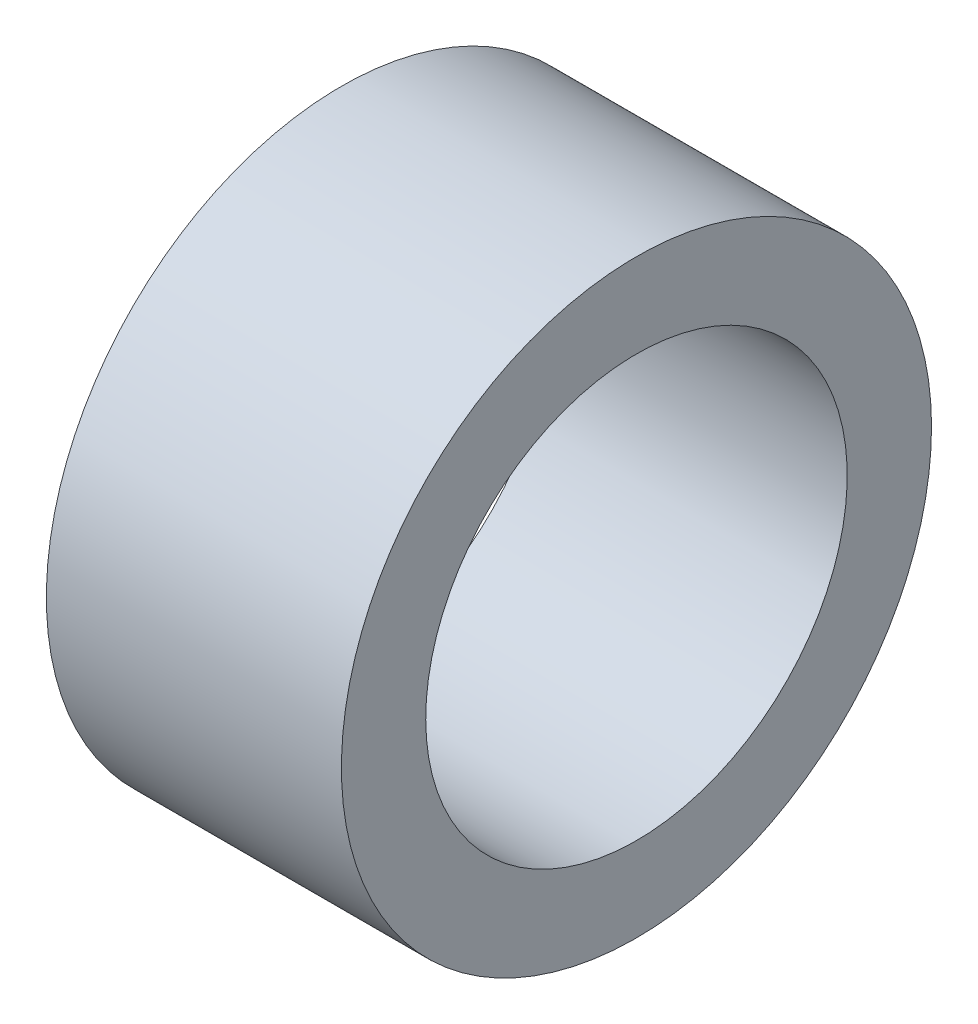
ISO-10303-21;
HEADER;
FILE_DESCRIPTION(('STEP AP214'),'2;1');
FILE_NAME('part.step','',(''),(''),'','','');
FILE_SCHEMA(('AUTOMOTIVE_DESIGN { 1 0 10303 214 1 1 1 1 }'));
ENDSEC;
DATA;
#1=APPLICATION_CONTEXT('core data for automotive mechanical design processes');
#2=APPLICATION_PROTOCOL_DEFINITION('international standard','automotive_design',2000,#1);
#3=PRODUCT_CONTEXT('',#1,'mechanical');
#4=PRODUCT('Part','Part','',(#3));
#5=PRODUCT_RELATED_PRODUCT_CATEGORY('part','',(#4));
#6=PRODUCT_DEFINITION_FORMATION('','',#4);
#7=PRODUCT_DEFINITION_CONTEXT('part definition',#1,'design');
#8=PRODUCT_DEFINITION('design','',#6,#7);
#9=PRODUCT_DEFINITION_SHAPE('','',#8);
#10=(LENGTH_UNIT() NAMED_UNIT(*) SI_UNIT(.MILLI.,.METRE.));
#11=(NAMED_UNIT(*) PLANE_ANGLE_UNIT() SI_UNIT($,.RADIAN.));
#12=(NAMED_UNIT(*) SI_UNIT($,.STERADIAN.) SOLID_ANGLE_UNIT());
#13=UNCERTAINTY_MEASURE_WITH_UNIT(LENGTH_MEASURE(1.E-05),#10,'distance_accuracy_value','');
#14=(GEOMETRIC_REPRESENTATION_CONTEXT(3) GLOBAL_UNCERTAINTY_ASSIGNED_CONTEXT((#13)) GLOBAL_UNIT_ASSIGNED_CONTEXT((#10,
#11,#12)) REPRESENTATION_CONTEXT('',''));
#15=CARTESIAN_POINT('',(0.,0.,0.));
#16=DIRECTION('',(0.,0.,1.));
#17=DIRECTION('',(1.,0.,0.));
#18=AXIS2_PLACEMENT_3D('',#15,#16,#17);
#19=CARTESIAN_POINT('',(-170.500000000003,37.9999999999994,8.91815473725468));
#20=DIRECTION('',(1.,0.,0.));
#21=DIRECTION('',(0.,0.245859277636287,-0.969305532636724));
#22=AXIS2_PLACEMENT_3D('',#19,#20,#21);
#23=CYLINDRICAL_SURFACE('',#22,3.);
#24=CARTESIAN_POINT('',(-170.500000000003,37.9999999999994,8.91815473725468));
#25=DIRECTION('',(-1.,0.,0.));
#26=DIRECTION('',(0.,-0.245859277636287,0.969305532636724));
#27=AXIS2_PLACEMENT_3D('',#24,#25,#26);
#28=CIRCLE('',#27,3.);
#29=CARTESIAN_POINT('',(-170.500000000003,37.2624221670905,11.8260713351649));
#30=VERTEX_POINT('',#29);
#31=EDGE_CURVE('E10',#30,#30,#28,.T.);
#32=ORIENTED_EDGE('',*,*,#31,.T.);
#33=EDGE_LOOP('',(#32));
#34=FACE_BOUND('',#33,.T.);
#35=CARTESIAN_POINT('',(-166.300000000003,37.9999999999994,8.91815473725468));
#36=DIRECTION('',(-1.,0.,0.));
#37=DIRECTION('',(0.,-0.245859277636287,0.969305532636724));
#38=AXIS2_PLACEMENT_3D('',#35,#36,#37);
#39=CIRCLE('',#38,3.);
#40=CARTESIAN_POINT('',(-166.300000000003,37.2624221670905,11.8260713351649));
#41=VERTEX_POINT('',#40);
#42=EDGE_CURVE('E29',#41,#41,#39,.T.);
#43=ORIENTED_EDGE('',*,*,#42,.F.);
#44=EDGE_LOOP('',(#43));
#45=FACE_BOUND('',#44,.T.);
#46=ADVANCED_FACE('F15',(#34,#45),#23,.F.);
#47=CARTESIAN_POINT('',(-170.500000000003,37.9999999999994,8.91815473725468));
#48=DIRECTION('',(1.,0.,0.));
#49=DIRECTION('',(0.,0.245859277636287,-0.969305532636724));
#50=AXIS2_PLACEMENT_3D('',#47,#48,#49);
#51=CYLINDRICAL_SURFACE('',#50,4.2);
#52=CARTESIAN_POINT('',(-170.500000000003,37.9999999999994,8.91815473725468));
#53=DIRECTION('',(-1.,0.,0.));
#54=DIRECTION('',(0.,-0.245859277636287,0.969305532636724));
#55=AXIS2_PLACEMENT_3D('',#52,#53,#54);
#56=CIRCLE('',#55,4.2);
#57=CARTESIAN_POINT('',(-170.500000000003,36.967391033927,12.9892379743289));
#58=VERTEX_POINT('',#57);
#59=EDGE_CURVE('E22',#58,#58,#56,.T.);
#60=ORIENTED_EDGE('',*,*,#59,.F.);
#61=EDGE_LOOP('',(#60));
#62=FACE_BOUND('',#61,.T.);
#63=CARTESIAN_POINT('',(-166.300000000003,37.9999999999994,8.91815473725468));
#64=DIRECTION('',(-1.,0.,0.));
#65=DIRECTION('',(0.,-0.245859277636287,0.969305532636724));
#66=AXIS2_PLACEMENT_3D('',#63,#64,#65);
#67=CIRCLE('',#66,4.2);
#68=CARTESIAN_POINT('',(-166.300000000003,36.967391033927,12.9892379743289));
#69=VERTEX_POINT('',#68);
#70=EDGE_CURVE('E35',#69,#69,#67,.T.);
#71=ORIENTED_EDGE('',*,*,#70,.T.);
#72=EDGE_LOOP('',(#71));
#73=FACE_BOUND('',#72,.T.);
#74=ADVANCED_FACE('F43',(#62,#73),#51,.T.);
#75=CARTESIAN_POINT('',(-170.500000000003,29.0051515381045,10.6996445062717));
#76=DIRECTION('',(-1.,0.,0.));
#77=DIRECTION('',(0.,0.,1.));
#78=AXIS2_PLACEMENT_3D('',#75,#76,#77);
#79=PLANE('',#78);
#80=ORIENTED_EDGE('',*,*,#31,.F.);
#81=EDGE_LOOP('',(#80));
#82=FACE_BOUND('',#81,.T.);
#83=ORIENTED_EDGE('',*,*,#59,.T.);
#84=EDGE_LOOP('',(#83));
#85=FACE_BOUND('',#84,.T.);
#86=ADVANCED_FACE('F47',(#82,#85),#79,.T.);
#87=CARTESIAN_POINT('',(-166.300000000003,29.0051515381045,10.6996445062717));
#88=DIRECTION('',(-1.,0.,0.));
#89=DIRECTION('',(0.,0.,1.));
#90=AXIS2_PLACEMENT_3D('',#87,#88,#89);
#91=PLANE('',#90);
#92=ORIENTED_EDGE('',*,*,#42,.T.);
#93=EDGE_LOOP('',(#92));
#94=FACE_BOUND('',#93,.T.);
#95=ORIENTED_EDGE('',*,*,#70,.F.);
#96=EDGE_LOOP('',(#95));
#97=FACE_BOUND('',#96,.T.);
#98=ADVANCED_FACE('F45',(#94,#97),#91,.F.);
#99=CLOSED_SHELL('',(#46,#74,#86,#98));
#100=MANIFOLD_SOLID_BREP('B1',#99);
#101=ADVANCED_BREP_SHAPE_REPRESENTATION('',(#18,#100),#14);
#102=SHAPE_DEFINITION_REPRESENTATION(#9,#101);
ENDSEC;
END-ISO-10303-21;
